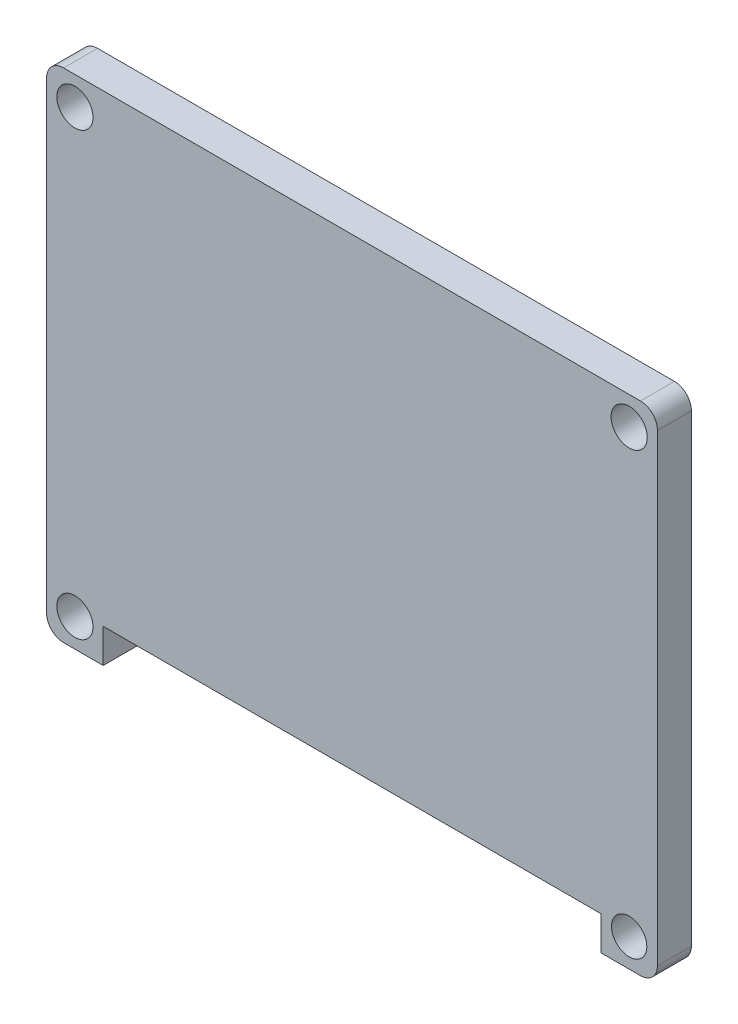
ISO-10303-21;
HEADER;
FILE_DESCRIPTION(('STEP AP214'),'2;1');
FILE_NAME('part.step','',(''),(''),'','','');
FILE_SCHEMA(('AUTOMOTIVE_DESIGN { 1 0 10303 214 1 1 1 1 }'));
ENDSEC;
DATA;
#1=APPLICATION_CONTEXT('core data for automotive mechanical design processes');
#2=APPLICATION_PROTOCOL_DEFINITION('international standard','automotive_design',2000,#1);
#3=PRODUCT_CONTEXT('',#1,'mechanical');
#4=PRODUCT('Part','Part','',(#3));
#5=PRODUCT_RELATED_PRODUCT_CATEGORY('part','',(#4));
#6=PRODUCT_DEFINITION_FORMATION('','',#4);
#7=PRODUCT_DEFINITION_CONTEXT('part definition',#1,'design');
#8=PRODUCT_DEFINITION('design','',#6,#7);
#9=PRODUCT_DEFINITION_SHAPE('','',#8);
#10=(LENGTH_UNIT() NAMED_UNIT(*) SI_UNIT(.MILLI.,.METRE.));
#11=(NAMED_UNIT(*) PLANE_ANGLE_UNIT() SI_UNIT($,.RADIAN.));
#12=(NAMED_UNIT(*) SI_UNIT($,.STERADIAN.) SOLID_ANGLE_UNIT());
#13=UNCERTAINTY_MEASURE_WITH_UNIT(LENGTH_MEASURE(1.E-05),#10,'distance_accuracy_value','');
#14=(GEOMETRIC_REPRESENTATION_CONTEXT(3) GLOBAL_UNCERTAINTY_ASSIGNED_CONTEXT((#13)) GLOBAL_UNIT_ASSIGNED_CONTEXT((#10,
#11,#12)) REPRESENTATION_CONTEXT('',''));
#15=CARTESIAN_POINT('',(0.,0.,0.));
#16=DIRECTION('',(0.,0.,1.));
#17=DIRECTION('',(1.,0.,0.));
#18=AXIS2_PLACEMENT_3D('',#15,#16,#17);
#19=CARTESIAN_POINT('',(-25.6719675018172,-20.5637637798851,1.5));
#20=DIRECTION('',(0.,0.,1.));
#21=DIRECTION('',(1.,0.,0.));
#22=AXIS2_PLACEMENT_3D('',#19,#20,#21);
#23=PLANE('',#22);
#24=CARTESIAN_POINT('',(24.3280324981829,19.4362362201149,1.5));
#25=DIRECTION('',(0.,0.,1.));
#26=DIRECTION('',(1.,0.,0.));
#27=AXIS2_PLACEMENT_3D('',#24,#25,#26);
#28=CIRCLE('',#27,1.6);
#29=CARTESIAN_POINT('',(25.9280324981829,19.4362362201149,1.5));
#30=VERTEX_POINT('',#29);
#31=EDGE_CURVE('E291',#30,#30,#28,.T.);
#32=ORIENTED_EDGE('',*,*,#31,.F.);
#33=EDGE_LOOP('',(#32));
#34=FACE_BOUND('',#33,.T.);
#35=CARTESIAN_POINT('',(-24.6719675018172,-19.5637637798851,1.5));
#36=DIRECTION('',(0.,0.,1.));
#37=DIRECTION('',(1.,0.,0.));
#38=AXIS2_PLACEMENT_3D('',#35,#36,#37);
#39=CIRCLE('',#38,1.6);
#40=CARTESIAN_POINT('',(-23.0719675018172,-19.5637637798851,1.5));
#41=VERTEX_POINT('',#40);
#42=EDGE_CURVE('E158',#41,#41,#39,.T.);
#43=ORIENTED_EDGE('',*,*,#42,.F.);
#44=EDGE_LOOP('',(#43));
#45=FACE_BOUND('',#44,.T.);
#46=CARTESIAN_POINT('',(-25.6719675018172,-20.5637637798851,1.5));
#47=DIRECTION('',(0.,0.,1.));
#48=DIRECTION('',(1.,0.,0.));
#49=AXIS2_PLACEMENT_3D('',#46,#47,#48);
#50=CIRCLE('',#49,1.5);
#51=CARTESIAN_POINT('',(-27.1719675018172,-20.5637637798851,1.5));
#52=VERTEX_POINT('',#51);
#53=CARTESIAN_POINT('',(-25.6719675018172,-22.0637637798851,1.5));
#54=VERTEX_POINT('',#53);
#55=EDGE_CURVE('E178',#52,#54,#50,.T.);
#56=ORIENTED_EDGE('',*,*,#55,.T.);
#57=DIRECTION('',(1.,0.,0.));
#58=VECTOR('',#57,1.);
#59=CARTESIAN_POINT('',(-25.6719675018172,-22.0637637798851,1.5));
#60=LINE('',#59,#58);
#61=CARTESIAN_POINT('',(-22.1719675018171,-22.0637637798851,1.5));
#62=VERTEX_POINT('',#61);
#63=EDGE_CURVE('E105',#54,#62,#60,.T.);
#64=ORIENTED_EDGE('',*,*,#63,.T.);
#65=DIRECTION('',(0.,1.,0.));
#66=VECTOR('',#65,1.);
#67=CARTESIAN_POINT('',(-22.1719675018172,-19.0637637798851,1.5));
#68=LINE('',#67,#66);
#69=CARTESIAN_POINT('',(-22.1719675018172,-19.0637637798851,1.5));
#70=VERTEX_POINT('',#69);
#71=EDGE_CURVE('E205',#62,#70,#68,.T.);
#72=ORIENTED_EDGE('',*,*,#71,.T.);
#73=DIRECTION('',(1.,0.,0.));
#74=VECTOR('',#73,1.);
#75=CARTESIAN_POINT('',(21.8280324981828,-19.0637637798851,1.5));
#76=LINE('',#75,#74);
#77=CARTESIAN_POINT('',(21.8280324981828,-19.0637637798851,1.5));
#78=VERTEX_POINT('',#77);
#79=EDGE_CURVE('E223',#70,#78,#76,.T.);
#80=ORIENTED_EDGE('',*,*,#79,.T.);
#81=DIRECTION('',(0.,-1.,0.));
#82=VECTOR('',#81,1.);
#83=CARTESIAN_POINT('',(21.8280324981829,-22.0637637798851,1.5));
#84=LINE('',#83,#82);
#85=CARTESIAN_POINT('',(21.8280324981829,-22.0637637798851,1.5));
#86=VERTEX_POINT('',#85);
#87=EDGE_CURVE('E220',#78,#86,#84,.T.);
#88=ORIENTED_EDGE('',*,*,#87,.T.);
#89=DIRECTION('',(1.,0.,0.));
#90=VECTOR('',#89,1.);
#91=CARTESIAN_POINT('',(22.8280324981828,-22.0637637798851,1.5));
#92=LINE('',#91,#90);
#93=CARTESIAN_POINT('',(25.3280324981828,-22.0637637798851,1.5));
#94=VERTEX_POINT('',#93);
#95=EDGE_CURVE('E222',#86,#94,#92,.T.);
#96=ORIENTED_EDGE('',*,*,#95,.T.);
#97=CARTESIAN_POINT('',(25.3280324981828,-20.5637637798851,1.5));
#98=DIRECTION('',(0.,0.,1.));
#99=DIRECTION('',(1.,0.,0.));
#100=AXIS2_PLACEMENT_3D('',#97,#98,#99);
#101=CIRCLE('',#100,1.5);
#102=CARTESIAN_POINT('',(26.8280324981828,-20.5637637798851,1.5));
#103=VERTEX_POINT('',#102);
#104=EDGE_CURVE('E225',#94,#103,#101,.T.);
#105=ORIENTED_EDGE('',*,*,#104,.T.);
#106=DIRECTION('',(0.,1.,0.));
#107=VECTOR('',#106,1.);
#108=CARTESIAN_POINT('',(26.8280324981828,-20.5637637798851,1.5));
#109=LINE('',#108,#107);
#110=CARTESIAN_POINT('',(26.8280324981829,20.4362362201149,1.5));
#111=VERTEX_POINT('',#110);
#112=EDGE_CURVE('E231',#103,#111,#109,.T.);
#113=ORIENTED_EDGE('',*,*,#112,.T.);
#114=CARTESIAN_POINT('',(25.3280324981829,20.4362362201149,1.5));
#115=DIRECTION('',(0.,0.,1.));
#116=DIRECTION('',(1.,0.,0.));
#117=AXIS2_PLACEMENT_3D('',#114,#115,#116);
#118=CIRCLE('',#117,1.5);
#119=CARTESIAN_POINT('',(25.3280324981829,21.9362362201149,1.5));
#120=VERTEX_POINT('',#119);
#121=EDGE_CURVE('E136',#111,#120,#118,.T.);
#122=ORIENTED_EDGE('',*,*,#121,.T.);
#123=DIRECTION('',(-1.,0.,0.));
#124=VECTOR('',#123,1.);
#125=CARTESIAN_POINT('',(25.3280324981829,21.9362362201149,1.5));
#126=LINE('',#125,#124);
#127=CARTESIAN_POINT('',(-25.6719675018172,21.9362362201149,1.5));
#128=VERTEX_POINT('',#127);
#129=EDGE_CURVE('E130',#120,#128,#126,.T.);
#130=ORIENTED_EDGE('',*,*,#129,.T.);
#131=CARTESIAN_POINT('',(-25.6719675018172,20.4362362201149,1.5));
#132=DIRECTION('',(0.,0.,1.));
#133=DIRECTION('',(1.,0.,0.));
#134=AXIS2_PLACEMENT_3D('',#131,#132,#133);
#135=CIRCLE('',#134,1.5);
#136=CARTESIAN_POINT('',(-27.1719675018172,20.4362362201149,1.5));
#137=VERTEX_POINT('',#136);
#138=EDGE_CURVE('E134',#128,#137,#135,.T.);
#139=ORIENTED_EDGE('',*,*,#138,.T.);
#140=DIRECTION('',(0.,-1.,0.));
#141=VECTOR('',#140,1.);
#142=CARTESIAN_POINT('',(-27.1719675018172,20.4362362201149,1.5));
#143=LINE('',#142,#141);
#144=EDGE_CURVE('E50',#137,#52,#143,.T.);
#145=ORIENTED_EDGE('',*,*,#144,.T.);
#146=EDGE_LOOP('',(#56,#64,#72,#80,#88,#96,#105,#113,#122,#130,#139,#145));
#147=FACE_BOUND('',#146,.T.);
#148=CARTESIAN_POINT('',(-24.6719675018172,19.4362362201149,1.5));
#149=DIRECTION('',(0.,0.,1.));
#150=DIRECTION('',(1.,0.,0.));
#151=AXIS2_PLACEMENT_3D('',#148,#149,#150);
#152=CIRCLE('',#151,1.6);
#153=CARTESIAN_POINT('',(-23.0719675018172,19.4362362201149,1.5));
#154=VERTEX_POINT('',#153);
#155=EDGE_CURVE('E297',#154,#154,#152,.T.);
#156=ORIENTED_EDGE('',*,*,#155,.F.);
#157=EDGE_LOOP('',(#156));
#158=FACE_BOUND('',#157,.T.);
#159=CARTESIAN_POINT('',(24.3280324981828,-19.5637637798851,1.5));
#160=DIRECTION('',(0.,0.,1.));
#161=DIRECTION('',(1.,0.,0.));
#162=AXIS2_PLACEMENT_3D('',#159,#160,#161);
#163=CIRCLE('',#162,1.55974089556969);
#164=CARTESIAN_POINT('',(25.8877733937525,-19.5637637798851,1.5));
#165=VERTEX_POINT('',#164);
#166=EDGE_CURVE('E282',#165,#165,#163,.T.);
#167=ORIENTED_EDGE('',*,*,#166,.F.);
#168=EDGE_LOOP('',(#167));
#169=FACE_BOUND('',#168,.T.);
#170=ADVANCED_FACE('F33',(#34,#45,#147,#158,#169),#23,.T.);
#171=CARTESIAN_POINT('',(-25.6719675018172,-20.5637637798851,-1.5));
#172=DIRECTION('',(0.,0.,1.));
#173=DIRECTION('',(1.,0.,0.));
#174=AXIS2_PLACEMENT_3D('',#171,#172,#173);
#175=PLANE('',#174);
#176=CARTESIAN_POINT('',(-25.6719675018172,-20.5637637798851,-1.5));
#177=DIRECTION('',(0.,0.,1.));
#178=DIRECTION('',(1.,0.,0.));
#179=AXIS2_PLACEMENT_3D('',#176,#177,#178);
#180=CIRCLE('',#179,1.5);
#181=CARTESIAN_POINT('',(-27.1719675018172,-20.5637637798851,-1.5));
#182=VERTEX_POINT('',#181);
#183=CARTESIAN_POINT('',(-25.6719675018172,-22.0637637798851,-1.5));
#184=VERTEX_POINT('',#183);
#185=EDGE_CURVE('E154',#182,#184,#180,.T.);
#186=ORIENTED_EDGE('',*,*,#185,.F.);
#187=DIRECTION('',(0.,-1.,0.));
#188=VECTOR('',#187,1.);
#189=CARTESIAN_POINT('',(-27.1719675018172,20.4362362201149,-1.5));
#190=LINE('',#189,#188);
#191=CARTESIAN_POINT('',(-27.1719675018172,20.4362362201149,-1.5));
#192=VERTEX_POINT('',#191);
#193=EDGE_CURVE('E97',#192,#182,#190,.T.);
#194=ORIENTED_EDGE('',*,*,#193,.F.);
#195=CARTESIAN_POINT('',(-25.6719675018172,20.4362362201149,-1.5));
#196=DIRECTION('',(0.,0.,1.));
#197=DIRECTION('',(1.,0.,0.));
#198=AXIS2_PLACEMENT_3D('',#195,#196,#197);
#199=CIRCLE('',#198,1.5);
#200=CARTESIAN_POINT('',(-25.6719675018172,21.9362362201149,-1.5));
#201=VERTEX_POINT('',#200);
#202=EDGE_CURVE('E91',#201,#192,#199,.T.);
#203=ORIENTED_EDGE('',*,*,#202,.F.);
#204=DIRECTION('',(-1.,0.,0.));
#205=VECTOR('',#204,1.);
#206=CARTESIAN_POINT('',(25.3280324981829,21.9362362201149,-1.5));
#207=LINE('',#206,#205);
#208=CARTESIAN_POINT('',(25.3280324981829,21.9362362201149,-1.5));
#209=VERTEX_POINT('',#208);
#210=EDGE_CURVE('E144',#209,#201,#207,.T.);
#211=ORIENTED_EDGE('',*,*,#210,.F.);
#212=CARTESIAN_POINT('',(25.3280324981829,20.4362362201149,-1.5));
#213=DIRECTION('',(0.,0.,1.));
#214=DIRECTION('',(1.,0.,0.));
#215=AXIS2_PLACEMENT_3D('',#212,#213,#214);
#216=CIRCLE('',#215,1.5);
#217=CARTESIAN_POINT('',(26.8280324981829,20.4362362201149,-1.5));
#218=VERTEX_POINT('',#217);
#219=EDGE_CURVE('E173',#218,#209,#216,.T.);
#220=ORIENTED_EDGE('',*,*,#219,.F.);
#221=DIRECTION('',(0.,1.,0.));
#222=VECTOR('',#221,1.);
#223=CARTESIAN_POINT('',(26.8280324981828,-20.5637637798851,-1.5));
#224=LINE('',#223,#222);
#225=CARTESIAN_POINT('',(26.8280324981828,-20.5637637798851,-1.5));
#226=VERTEX_POINT('',#225);
#227=EDGE_CURVE('E171',#226,#218,#224,.T.);
#228=ORIENTED_EDGE('',*,*,#227,.F.);
#229=CARTESIAN_POINT('',(25.3280324981828,-20.5637637798851,-1.5));
#230=DIRECTION('',(0.,0.,1.));
#231=DIRECTION('',(1.,0.,0.));
#232=AXIS2_PLACEMENT_3D('',#229,#230,#231);
#233=CIRCLE('',#232,1.5);
#234=CARTESIAN_POINT('',(25.3280324981828,-22.0637637798851,-1.5));
#235=VERTEX_POINT('',#234);
#236=EDGE_CURVE('E169',#235,#226,#233,.T.);
#237=ORIENTED_EDGE('',*,*,#236,.F.);
#238=DIRECTION('',(1.,0.,0.));
#239=VECTOR('',#238,1.);
#240=CARTESIAN_POINT('',(22.8280324981828,-22.0637637798851,-1.5));
#241=LINE('',#240,#239);
#242=CARTESIAN_POINT('',(21.8280324981829,-22.0637637798851,-1.5));
#243=VERTEX_POINT('',#242);
#244=EDGE_CURVE('E167',#243,#235,#241,.T.);
#245=ORIENTED_EDGE('',*,*,#244,.F.);
#246=DIRECTION('',(0.,-1.,0.));
#247=VECTOR('',#246,1.);
#248=CARTESIAN_POINT('',(21.8280324981829,-22.0637637798851,-1.5));
#249=LINE('',#248,#247);
#250=CARTESIAN_POINT('',(21.8280324981828,-19.0637637798851,-1.5));
#251=VERTEX_POINT('',#250);
#252=EDGE_CURVE('E164',#251,#243,#249,.T.);
#253=ORIENTED_EDGE('',*,*,#252,.F.);
#254=DIRECTION('',(1.,0.,0.));
#255=VECTOR('',#254,1.);
#256=CARTESIAN_POINT('',(21.8280324981828,-19.0637637798851,-1.5));
#257=LINE('',#256,#255);
#258=CARTESIAN_POINT('',(-22.1719675018172,-19.0637637798851,-1.5));
#259=VERTEX_POINT('',#258);
#260=EDGE_CURVE('E162',#259,#251,#257,.T.);
#261=ORIENTED_EDGE('',*,*,#260,.F.);
#262=DIRECTION('',(0.,1.,0.));
#263=VECTOR('',#262,1.);
#264=CARTESIAN_POINT('',(-22.1719675018172,-19.0637637798851,-1.5));
#265=LINE('',#264,#263);
#266=CARTESIAN_POINT('',(-22.1719675018171,-22.0637637798851,-1.5));
#267=VERTEX_POINT('',#266);
#268=EDGE_CURVE('E160',#267,#259,#265,.T.);
#269=ORIENTED_EDGE('',*,*,#268,.F.);
#270=DIRECTION('',(1.,0.,0.));
#271=VECTOR('',#270,1.);
#272=CARTESIAN_POINT('',(-22.1719675018171,-22.0637637798851,-1.5));
#273=LINE('',#272,#271);
#274=EDGE_CURVE('E157',#184,#267,#273,.T.);
#275=ORIENTED_EDGE('',*,*,#274,.F.);
#276=EDGE_LOOP('',(#186,#194,#203,#211,#220,#228,#237,#245,#253,#261,#269,#275));
#277=FACE_BOUND('',#276,.T.);
#278=CARTESIAN_POINT('',(-24.6719675018172,-19.5637637798851,-1.5));
#279=DIRECTION('',(0.,0.,1.));
#280=DIRECTION('',(1.,0.,0.));
#281=AXIS2_PLACEMENT_3D('',#278,#279,#280);
#282=CIRCLE('',#281,1.6);
#283=CARTESIAN_POINT('',(-23.0719675018172,-19.5637637798851,-1.5));
#284=VERTEX_POINT('',#283);
#285=EDGE_CURVE('E300',#284,#284,#282,.T.);
#286=ORIENTED_EDGE('',*,*,#285,.T.);
#287=EDGE_LOOP('',(#286));
#288=FACE_BOUND('',#287,.T.);
#289=CARTESIAN_POINT('',(-24.6719675018172,19.4362362201149,-1.5));
#290=DIRECTION('',(0.,0.,1.));
#291=DIRECTION('',(1.,0.,0.));
#292=AXIS2_PLACEMENT_3D('',#289,#290,#291);
#293=CIRCLE('',#292,1.6);
#294=CARTESIAN_POINT('',(-23.0719675018172,19.4362362201149,-1.5));
#295=VERTEX_POINT('',#294);
#296=EDGE_CURVE('E294',#295,#295,#293,.T.);
#297=ORIENTED_EDGE('',*,*,#296,.T.);
#298=EDGE_LOOP('',(#297));
#299=FACE_BOUND('',#298,.T.);
#300=CARTESIAN_POINT('',(24.3280324981829,19.4362362201149,-1.5));
#301=DIRECTION('',(0.,0.,1.));
#302=DIRECTION('',(1.,0.,0.));
#303=AXIS2_PLACEMENT_3D('',#300,#301,#302);
#304=CIRCLE('',#303,1.6);
#305=CARTESIAN_POINT('',(25.9280324981829,19.4362362201149,-1.5));
#306=VERTEX_POINT('',#305);
#307=EDGE_CURVE('E288',#306,#306,#304,.T.);
#308=ORIENTED_EDGE('',*,*,#307,.T.);
#309=EDGE_LOOP('',(#308));
#310=FACE_BOUND('',#309,.T.);
#311=CARTESIAN_POINT('',(24.3280324981828,-19.5637637798851,-1.5));
#312=DIRECTION('',(0.,0.,1.));
#313=DIRECTION('',(1.,0.,0.));
#314=AXIS2_PLACEMENT_3D('',#311,#312,#313);
#315=CIRCLE('',#314,1.55974089556969);
#316=CARTESIAN_POINT('',(25.8877733937525,-19.5637637798851,-1.5));
#317=VERTEX_POINT('',#316);
#318=EDGE_CURVE('E285',#317,#317,#315,.T.);
#319=ORIENTED_EDGE('',*,*,#318,.T.);
#320=EDGE_LOOP('',(#319));
#321=FACE_BOUND('',#320,.T.);
#322=ADVANCED_FACE('F209',(#277,#288,#299,#310,#321),#175,.F.);
#323=CARTESIAN_POINT('',(-25.6719675018172,-20.5637637798851,1.5));
#324=DIRECTION('',(0.,0.,-1.));
#325=DIRECTION('',(-1.,0.,0.));
#326=AXIS2_PLACEMENT_3D('',#323,#324,#325);
#327=CYLINDRICAL_SURFACE('',#326,1.5);
#328=ORIENTED_EDGE('',*,*,#185,.T.);
#329=DIRECTION('',(0.,0.,-1.));
#330=VECTOR('',#329,1.);
#331=CARTESIAN_POINT('',(-25.6719675018172,-22.0637637798851,1.5));
#332=LINE('',#331,#330);
#333=EDGE_CURVE('E11',#54,#184,#332,.T.);
#334=ORIENTED_EDGE('',*,*,#333,.F.);
#335=ORIENTED_EDGE('',*,*,#55,.F.);
#336=DIRECTION('',(0.,0.,-1.));
#337=VECTOR('',#336,1.);
#338=CARTESIAN_POINT('',(-27.1719675018172,-20.5637637798851,1.5));
#339=LINE('',#338,#337);
#340=EDGE_CURVE('E150',#52,#182,#339,.T.);
#341=ORIENTED_EDGE('',*,*,#340,.T.);
#342=EDGE_LOOP('',(#328,#334,#335,#341));
#343=FACE_BOUND('',#342,.T.);
#344=ADVANCED_FACE('F35',(#343),#327,.T.);
#345=CARTESIAN_POINT('',(-22.1719675018171,-22.0637637798851,1.5));
#346=DIRECTION('',(0.,1.,0.));
#347=DIRECTION('',(0.,0.,1.));
#348=AXIS2_PLACEMENT_3D('',#345,#346,#347);
#349=PLANE('',#348);
#350=ORIENTED_EDGE('',*,*,#274,.T.);
#351=DIRECTION('',(0.,0.,-1.));
#352=VECTOR('',#351,1.);
#353=CARTESIAN_POINT('',(-22.1719675018171,-22.0637637798851,1.5));
#354=LINE('',#353,#352);
#355=EDGE_CURVE('E42',#62,#267,#354,.T.);
#356=ORIENTED_EDGE('',*,*,#355,.F.);
#357=ORIENTED_EDGE('',*,*,#63,.F.);
#358=ORIENTED_EDGE('',*,*,#333,.T.);
#359=EDGE_LOOP('',(#350,#356,#357,#358));
#360=FACE_BOUND('',#359,.T.);
#361=ADVANCED_FACE('F411',(#360),#349,.F.);
#362=CARTESIAN_POINT('',(-22.1719675018172,-19.0637637798851,1.5));
#363=DIRECTION('',(-1.,0.,0.));
#364=DIRECTION('',(0.,-1.,0.));
#365=AXIS2_PLACEMENT_3D('',#362,#363,#364);
#366=PLANE('',#365);
#367=ORIENTED_EDGE('',*,*,#268,.T.);
#368=DIRECTION('',(0.,0.,-1.));
#369=VECTOR('',#368,1.);
#370=CARTESIAN_POINT('',(-22.1719675018172,-19.0637637798851,1.5));
#371=LINE('',#370,#369);
#372=EDGE_CURVE('E197',#70,#259,#371,.T.);
#373=ORIENTED_EDGE('',*,*,#372,.F.);
#374=ORIENTED_EDGE('',*,*,#71,.F.);
#375=ORIENTED_EDGE('',*,*,#355,.T.);
#376=EDGE_LOOP('',(#367,#373,#374,#375));
#377=FACE_BOUND('',#376,.T.);
#378=ADVANCED_FACE('F203',(#377),#366,.F.);
#379=CARTESIAN_POINT('',(21.8280324981828,-19.0637637798851,1.5));
#380=DIRECTION('',(0.,1.,0.));
#381=DIRECTION('',(0.,0.,1.));
#382=AXIS2_PLACEMENT_3D('',#379,#380,#381);
#383=PLANE('',#382);
#384=ORIENTED_EDGE('',*,*,#260,.T.);
#385=DIRECTION('',(0.,0.,-1.));
#386=VECTOR('',#385,1.);
#387=CARTESIAN_POINT('',(21.8280324981828,-19.0637637798851,1.5));
#388=LINE('',#387,#386);
#389=EDGE_CURVE('E194',#78,#251,#388,.T.);
#390=ORIENTED_EDGE('',*,*,#389,.F.);
#391=ORIENTED_EDGE('',*,*,#79,.F.);
#392=ORIENTED_EDGE('',*,*,#372,.T.);
#393=EDGE_LOOP('',(#384,#390,#391,#392));
#394=FACE_BOUND('',#393,.T.);
#395=ADVANCED_FACE('F214',(#394),#383,.F.);
#396=CARTESIAN_POINT('',(21.8280324981829,-22.0637637798851,1.5));
#397=DIRECTION('',(1.,0.,0.));
#398=DIRECTION('',(0.,1.,0.));
#399=AXIS2_PLACEMENT_3D('',#396,#397,#398);
#400=PLANE('',#399);
#401=ORIENTED_EDGE('',*,*,#252,.T.);
#402=DIRECTION('',(0.,0.,-1.));
#403=VECTOR('',#402,1.);
#404=CARTESIAN_POINT('',(21.8280324981829,-22.0637637798851,1.5));
#405=LINE('',#404,#403);
#406=EDGE_CURVE('E191',#86,#243,#405,.T.);
#407=ORIENTED_EDGE('',*,*,#406,.F.);
#408=ORIENTED_EDGE('',*,*,#87,.F.);
#409=ORIENTED_EDGE('',*,*,#389,.T.);
#410=EDGE_LOOP('',(#401,#407,#408,#409));
#411=FACE_BOUND('',#410,.T.);
#412=ADVANCED_FACE('F218',(#411),#400,.F.);
#413=CARTESIAN_POINT('',(22.8280324981828,-22.0637637798851,1.5));
#414=DIRECTION('',(0.,1.,0.));
#415=DIRECTION('',(0.,0.,1.));
#416=AXIS2_PLACEMENT_3D('',#413,#414,#415);
#417=PLANE('',#416);
#418=ORIENTED_EDGE('',*,*,#244,.T.);
#419=DIRECTION('',(0.,0.,-1.));
#420=VECTOR('',#419,1.);
#421=CARTESIAN_POINT('',(25.3280324981828,-22.0637637798851,1.5));
#422=LINE('',#421,#420);
#423=EDGE_CURVE('E188',#94,#235,#422,.T.);
#424=ORIENTED_EDGE('',*,*,#423,.F.);
#425=ORIENTED_EDGE('',*,*,#95,.F.);
#426=ORIENTED_EDGE('',*,*,#406,.T.);
#427=EDGE_LOOP('',(#418,#424,#425,#426));
#428=FACE_BOUND('',#427,.T.);
#429=ADVANCED_FACE('F375',(#428),#417,.F.);
#430=CARTESIAN_POINT('',(25.3280324981828,-20.5637637798851,1.5));
#431=DIRECTION('',(0.,0.,-1.));
#432=DIRECTION('',(-1.,0.,0.));
#433=AXIS2_PLACEMENT_3D('',#430,#431,#432);
#434=CYLINDRICAL_SURFACE('',#433,1.5);
#435=ORIENTED_EDGE('',*,*,#236,.T.);
#436=DIRECTION('',(0.,0.,-1.));
#437=VECTOR('',#436,1.);
#438=CARTESIAN_POINT('',(26.8280324981828,-20.5637637798851,1.5));
#439=LINE('',#438,#437);
#440=EDGE_CURVE('E185',#103,#226,#439,.T.);
#441=ORIENTED_EDGE('',*,*,#440,.F.);
#442=ORIENTED_EDGE('',*,*,#104,.F.);
#443=ORIENTED_EDGE('',*,*,#423,.T.);
#444=EDGE_LOOP('',(#435,#441,#442,#443));
#445=FACE_BOUND('',#444,.T.);
#446=ADVANCED_FACE('F366',(#445),#434,.T.);
#447=CARTESIAN_POINT('',(26.8280324981828,-20.5637637798851,1.5));
#448=DIRECTION('',(-1.,0.,0.));
#449=DIRECTION('',(0.,-1.,0.));
#450=AXIS2_PLACEMENT_3D('',#447,#448,#449);
#451=PLANE('',#450);
#452=ORIENTED_EDGE('',*,*,#227,.T.);
#453=DIRECTION('',(0.,0.,-1.));
#454=VECTOR('',#453,1.);
#455=CARTESIAN_POINT('',(26.8280324981829,20.4362362201149,1.5));
#456=LINE('',#455,#454);
#457=EDGE_CURVE('E182',#111,#218,#456,.T.);
#458=ORIENTED_EDGE('',*,*,#457,.F.);
#459=ORIENTED_EDGE('',*,*,#112,.F.);
#460=ORIENTED_EDGE('',*,*,#440,.T.);
#461=EDGE_LOOP('',(#452,#458,#459,#460));
#462=FACE_BOUND('',#461,.T.);
#463=ADVANCED_FACE('F237',(#462),#451,.F.);
#464=CARTESIAN_POINT('',(25.3280324981829,20.4362362201149,1.5));
#465=DIRECTION('',(0.,0.,-1.));
#466=DIRECTION('',(-1.,0.,0.));
#467=AXIS2_PLACEMENT_3D('',#464,#465,#466);
#468=CYLINDRICAL_SURFACE('',#467,1.5);
#469=ORIENTED_EDGE('',*,*,#219,.T.);
#470=DIRECTION('',(0.,0.,-1.));
#471=VECTOR('',#470,1.);
#472=CARTESIAN_POINT('',(25.3280324981829,21.9362362201149,1.5));
#473=LINE('',#472,#471);
#474=EDGE_CURVE('E145',#120,#209,#473,.T.);
#475=ORIENTED_EDGE('',*,*,#474,.F.);
#476=ORIENTED_EDGE('',*,*,#121,.F.);
#477=ORIENTED_EDGE('',*,*,#457,.T.);
#478=EDGE_LOOP('',(#469,#475,#476,#477));
#479=FACE_BOUND('',#478,.T.);
#480=ADVANCED_FACE('F241',(#479),#468,.T.);
#481=CARTESIAN_POINT('',(25.3280324981829,21.9362362201149,1.5));
#482=DIRECTION('',(0.,-1.,0.));
#483=DIRECTION('',(0.,0.,-1.));
#484=AXIS2_PLACEMENT_3D('',#481,#482,#483);
#485=PLANE('',#484);
#486=ORIENTED_EDGE('',*,*,#210,.T.);
#487=DIRECTION('',(0.,0.,-1.));
#488=VECTOR('',#487,1.);
#489=CARTESIAN_POINT('',(-25.6719675018172,21.9362362201149,1.5));
#490=LINE('',#489,#488);
#491=EDGE_CURVE('E141',#128,#201,#490,.T.);
#492=ORIENTED_EDGE('',*,*,#491,.F.);
#493=ORIENTED_EDGE('',*,*,#129,.F.);
#494=ORIENTED_EDGE('',*,*,#474,.T.);
#495=EDGE_LOOP('',(#486,#492,#493,#494));
#496=FACE_BOUND('',#495,.T.);
#497=ADVANCED_FACE('F142',(#496),#485,.F.);
#498=CARTESIAN_POINT('',(-25.6719675018172,20.4362362201149,1.5));
#499=DIRECTION('',(0.,0.,-1.));
#500=DIRECTION('',(-1.,0.,0.));
#501=AXIS2_PLACEMENT_3D('',#498,#499,#500);
#502=CYLINDRICAL_SURFACE('',#501,1.5);
#503=ORIENTED_EDGE('',*,*,#202,.T.);
#504=DIRECTION('',(0.,0.,-1.));
#505=VECTOR('',#504,1.);
#506=CARTESIAN_POINT('',(-27.1719675018172,20.4362362201149,1.5));
#507=LINE('',#506,#505);
#508=EDGE_CURVE('E146',#137,#192,#507,.T.);
#509=ORIENTED_EDGE('',*,*,#508,.F.);
#510=ORIENTED_EDGE('',*,*,#138,.F.);
#511=ORIENTED_EDGE('',*,*,#491,.T.);
#512=EDGE_LOOP('',(#503,#509,#510,#511));
#513=FACE_BOUND('',#512,.T.);
#514=ADVANCED_FACE('F148',(#513),#502,.T.);
#515=CARTESIAN_POINT('',(-27.1719675018172,20.4362362201149,1.5));
#516=DIRECTION('',(1.,0.,0.));
#517=DIRECTION('',(0.,1.,0.));
#518=AXIS2_PLACEMENT_3D('',#515,#516,#517);
#519=PLANE('',#518);
#520=ORIENTED_EDGE('',*,*,#193,.T.);
#521=ORIENTED_EDGE('',*,*,#340,.F.);
#522=ORIENTED_EDGE('',*,*,#144,.F.);
#523=ORIENTED_EDGE('',*,*,#508,.T.);
#524=EDGE_LOOP('',(#520,#521,#522,#523));
#525=FACE_BOUND('',#524,.T.);
#526=ADVANCED_FACE('F245',(#525),#519,.F.);
#527=CARTESIAN_POINT('',(-24.6719675018172,-19.5637637798851,1.5));
#528=DIRECTION('',(0.,0.,-1.));
#529=DIRECTION('',(-1.,0.,0.));
#530=AXIS2_PLACEMENT_3D('',#527,#528,#529);
#531=CYLINDRICAL_SURFACE('',#530,1.6);
#532=ORIENTED_EDGE('',*,*,#42,.T.);
#533=EDGE_LOOP('',(#532));
#534=FACE_BOUND('',#533,.T.);
#535=ORIENTED_EDGE('',*,*,#285,.F.);
#536=EDGE_LOOP('',(#535));
#537=FACE_BOUND('',#536,.T.);
#538=ADVANCED_FACE('F247',(#534,#537),#531,.F.);
#539=CARTESIAN_POINT('',(-24.6719675018172,19.4362362201149,1.5));
#540=DIRECTION('',(0.,0.,-1.));
#541=DIRECTION('',(-1.,0.,0.));
#542=AXIS2_PLACEMENT_3D('',#539,#540,#541);
#543=CYLINDRICAL_SURFACE('',#542,1.6);
#544=ORIENTED_EDGE('',*,*,#155,.T.);
#545=EDGE_LOOP('',(#544));
#546=FACE_BOUND('',#545,.T.);
#547=ORIENTED_EDGE('',*,*,#296,.F.);
#548=EDGE_LOOP('',(#547));
#549=FACE_BOUND('',#548,.T.);
#550=ADVANCED_FACE('F253',(#546,#549),#543,.F.);
#551=CARTESIAN_POINT('',(24.3280324981829,19.4362362201149,1.5));
#552=DIRECTION('',(0.,0.,-1.));
#553=DIRECTION('',(-1.,0.,0.));
#554=AXIS2_PLACEMENT_3D('',#551,#552,#553);
#555=CYLINDRICAL_SURFACE('',#554,1.6);
#556=ORIENTED_EDGE('',*,*,#31,.T.);
#557=EDGE_LOOP('',(#556));
#558=FACE_BOUND('',#557,.T.);
#559=ORIENTED_EDGE('',*,*,#307,.F.);
#560=EDGE_LOOP('',(#559));
#561=FACE_BOUND('',#560,.T.);
#562=ADVANCED_FACE('F269',(#558,#561),#555,.F.);
#563=CARTESIAN_POINT('',(24.3280324981828,-19.5637637798851,1.5));
#564=DIRECTION('',(0.,0.,-1.));
#565=DIRECTION('',(-1.,0.,0.));
#566=AXIS2_PLACEMENT_3D('',#563,#564,#565);
#567=CYLINDRICAL_SURFACE('',#566,1.55974089556969);
#568=ORIENTED_EDGE('',*,*,#166,.T.);
#569=EDGE_LOOP('',(#568));
#570=FACE_BOUND('',#569,.T.);
#571=ORIENTED_EDGE('',*,*,#318,.F.);
#572=EDGE_LOOP('',(#571));
#573=FACE_BOUND('',#572,.T.);
#574=ADVANCED_FACE('F273',(#570,#573),#567,.F.);
#575=CLOSED_SHELL('',(#170,#322,#344,#361,#378,#395,#412,#429,#446,#463,#480,#497,#514,#526,
#538,#550,#562,#574));
#576=MANIFOLD_SOLID_BREP('B2',#575);
#577=ADVANCED_BREP_SHAPE_REPRESENTATION('',(#18,#576),#14);
#578=SHAPE_DEFINITION_REPRESENTATION(#9,#577);
ENDSEC;
END-ISO-10303-21;
